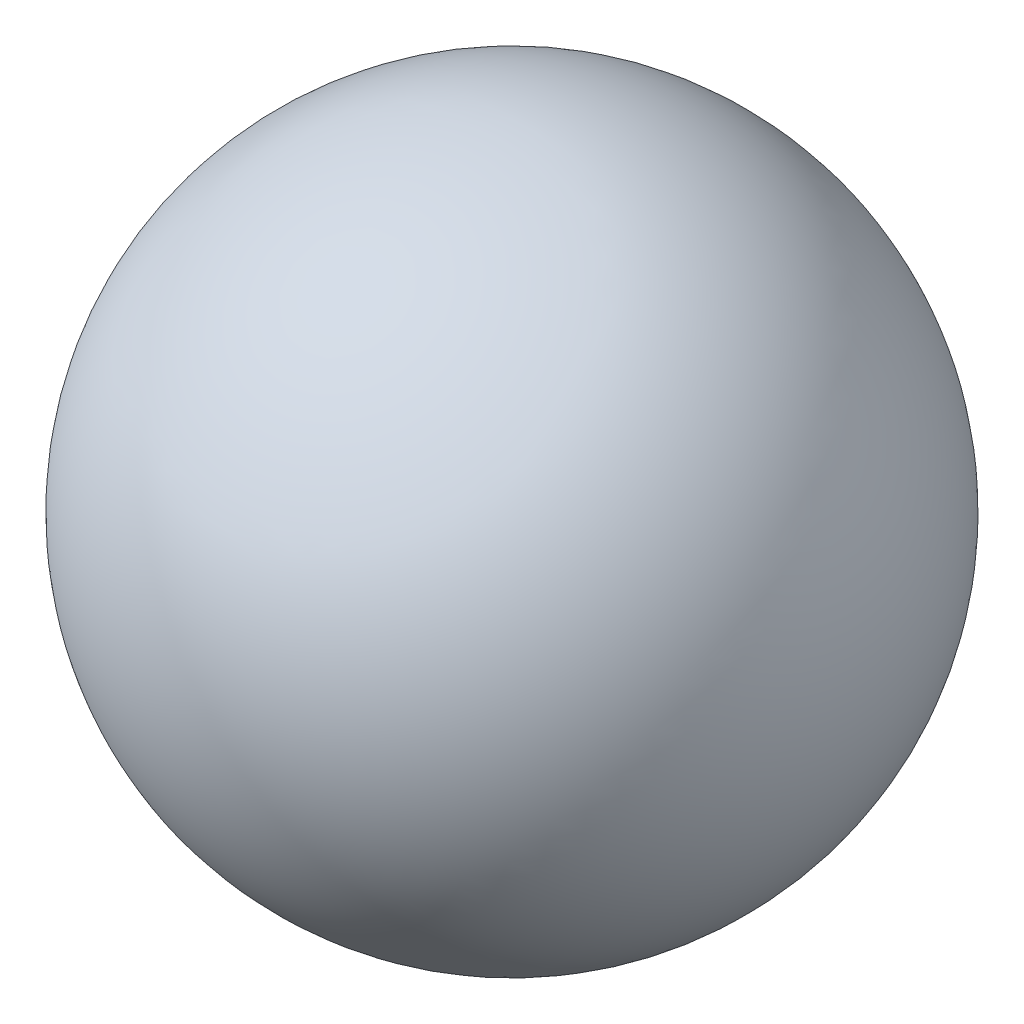
ISO-10303-21;
HEADER;
FILE_DESCRIPTION(('STEP AP214'),'2;1');
FILE_NAME('part.step','',(''),(''),'','','');
FILE_SCHEMA(('AUTOMOTIVE_DESIGN { 1 0 10303 214 1 1 1 1 }'));
ENDSEC;
DATA;
#1=APPLICATION_CONTEXT('core data for automotive mechanical design processes');
#2=APPLICATION_PROTOCOL_DEFINITION('international standard','automotive_design',2000,#1);
#3=PRODUCT_CONTEXT('',#1,'mechanical');
#4=PRODUCT('Part','Part','',(#3));
#5=PRODUCT_RELATED_PRODUCT_CATEGORY('part','',(#4));
#6=PRODUCT_DEFINITION_FORMATION('','',#4);
#7=PRODUCT_DEFINITION_CONTEXT('part definition',#1,'design');
#8=PRODUCT_DEFINITION('design','',#6,#7);
#9=PRODUCT_DEFINITION_SHAPE('','',#8);
#10=(LENGTH_UNIT() NAMED_UNIT(*) SI_UNIT(.MILLI.,.METRE.));
#11=(NAMED_UNIT(*) PLANE_ANGLE_UNIT() SI_UNIT($,.RADIAN.));
#12=(NAMED_UNIT(*) SI_UNIT($,.STERADIAN.) SOLID_ANGLE_UNIT());
#13=UNCERTAINTY_MEASURE_WITH_UNIT(LENGTH_MEASURE(1.E-05),#10,'distance_accuracy_value','');
#14=(GEOMETRIC_REPRESENTATION_CONTEXT(3) GLOBAL_UNCERTAINTY_ASSIGNED_CONTEXT((#13)) GLOBAL_UNIT_ASSIGNED_CONTEXT((#10,
#11,#12)) REPRESENTATION_CONTEXT('',''));
#15=CARTESIAN_POINT('',(0.,0.,0.));
#16=DIRECTION('',(0.,0.,1.));
#17=DIRECTION('',(1.,0.,0.));
#18=AXIS2_PLACEMENT_3D('',#15,#16,#17);
#19=CARTESIAN_POINT('',(0.,0.,0.));
#20=DIRECTION('',(0.,0.,-1.));
#21=DIRECTION('',(1.,0.,0.));
#22=AXIS2_PLACEMENT_3D('',#19,#20,#21);
#23=SPHERICAL_SURFACE('',#22,8.27);
#24=CARTESIAN_POINT('',(0.,0.,-8.27));
#25=VERTEX_POINT('',#24);
#26=VERTEX_LOOP('',#25);
#27=FACE_BOUND('',#26,.T.);
#28=ADVANCED_FACE('F33',(#27),#23,.T.);
#29=CLOSED_SHELL('',(#28));
#30=MANIFOLD_SOLID_BREP('B2',#29);
#31=ADVANCED_BREP_SHAPE_REPRESENTATION('',(#18,#30),#14);
#32=SHAPE_DEFINITION_REPRESENTATION(#9,#31);
ENDSEC;
END-ISO-10303-21;
